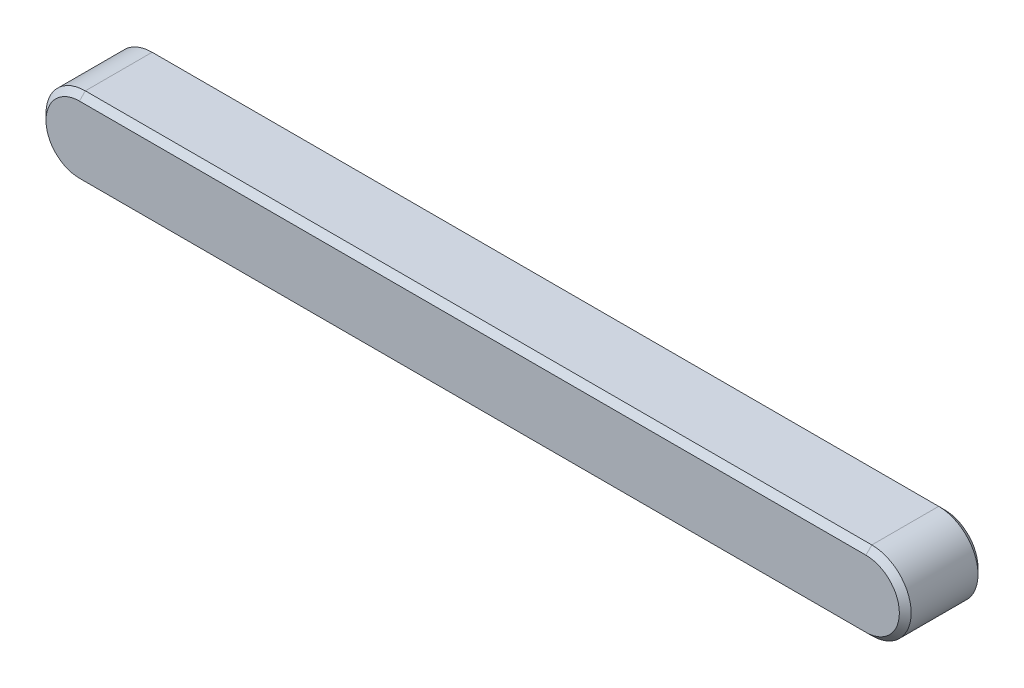
ISO-10303-21;
HEADER;
FILE_DESCRIPTION(('STEP AP214'),'2;1');
FILE_NAME('part.step','',(''),(''),'','','');
FILE_SCHEMA(('AUTOMOTIVE_DESIGN { 1 0 10303 214 1 1 1 1 }'));
ENDSEC;
DATA;
#1=APPLICATION_CONTEXT('core data for automotive mechanical design processes');
#2=APPLICATION_PROTOCOL_DEFINITION('international standard','automotive_design',2000,#1);
#3=PRODUCT_CONTEXT('',#1,'mechanical');
#4=PRODUCT('Part','Part','',(#3));
#5=PRODUCT_RELATED_PRODUCT_CATEGORY('part','',(#4));
#6=PRODUCT_DEFINITION_FORMATION('','',#4);
#7=PRODUCT_DEFINITION_CONTEXT('part definition',#1,'design');
#8=PRODUCT_DEFINITION('design','',#6,#7);
#9=PRODUCT_DEFINITION_SHAPE('','',#8);
#10=(LENGTH_UNIT() NAMED_UNIT(*) SI_UNIT(.MILLI.,.METRE.));
#11=(NAMED_UNIT(*) PLANE_ANGLE_UNIT() SI_UNIT($,.RADIAN.));
#12=(NAMED_UNIT(*) SI_UNIT($,.STERADIAN.) SOLID_ANGLE_UNIT());
#13=UNCERTAINTY_MEASURE_WITH_UNIT(LENGTH_MEASURE(1.E-05),#10,'distance_accuracy_value','');
#14=(GEOMETRIC_REPRESENTATION_CONTEXT(3) GLOBAL_UNCERTAINTY_ASSIGNED_CONTEXT((#13)) GLOBAL_UNIT_ASSIGNED_CONTEXT((#10,
#11,#12)) REPRESENTATION_CONTEXT('',''));
#15=CARTESIAN_POINT('',(0.,0.,0.));
#16=DIRECTION('',(0.,0.,1.));
#17=DIRECTION('',(1.,0.,0.));
#18=AXIS2_PLACEMENT_3D('',#15,#16,#17);
#19=CARTESIAN_POINT('',(-20.,0.,2.));
#20=DIRECTION('',(0.,0.,-1.));
#21=DIRECTION('',(-1.,0.,0.));
#22=AXIS2_PLACEMENT_3D('',#19,#20,#21);
#23=CYLINDRICAL_SURFACE('',#22,2.);
#24=DIRECTION('',(0.,0.,-1.));
#25=VECTOR('',#24,1.);
#26=CARTESIAN_POINT('',(-20.,2.,2.));
#27=LINE('',#26,#25);
#28=CARTESIAN_POINT('',(-20.,2.,1.70000000000001));
#29=VERTEX_POINT('',#28);
#30=CARTESIAN_POINT('',(-20.,2.,-1.7));
#31=VERTEX_POINT('',#30);
#32=EDGE_CURVE('E111',#29,#31,#27,.T.);
#33=ORIENTED_EDGE('',*,*,#32,.T.);
#34=CARTESIAN_POINT('',(-20.,0.,-1.7));
#35=DIRECTION('',(0.,0.,1.));
#36=DIRECTION('',(1.,0.,0.));
#37=AXIS2_PLACEMENT_3D('',#34,#35,#36);
#38=CIRCLE('',#37,2.);
#39=CARTESIAN_POINT('',(-20.,-2.,-1.7));
#40=VERTEX_POINT('',#39);
#41=EDGE_CURVE('E186',#31,#40,#38,.T.);
#42=ORIENTED_EDGE('',*,*,#41,.T.);
#43=DIRECTION('',(0.,0.,-1.));
#44=VECTOR('',#43,1.);
#45=CARTESIAN_POINT('',(-20.,-2.,2.));
#46=LINE('',#45,#44);
#47=CARTESIAN_POINT('',(-20.,-2.,1.70000000000001));
#48=VERTEX_POINT('',#47);
#49=EDGE_CURVE('E132',#48,#40,#46,.T.);
#50=ORIENTED_EDGE('',*,*,#49,.F.);
#51=CARTESIAN_POINT('',(-20.,0.,1.70000000000001));
#52=DIRECTION('',(0.,0.,1.));
#53=DIRECTION('',(1.,0.,0.));
#54=AXIS2_PLACEMENT_3D('',#51,#52,#53);
#55=CIRCLE('',#54,2.);
#56=EDGE_CURVE('E184',#48,#29,#55,.F.);
#57=ORIENTED_EDGE('',*,*,#56,.T.);
#58=EDGE_LOOP('',(#33,#42,#50,#57));
#59=FACE_BOUND('',#58,.T.);
#60=ADVANCED_FACE('F35',(#59),#23,.T.);
#61=CARTESIAN_POINT('',(-20.,-2.,2.));
#62=DIRECTION('',(0.,1.,0.));
#63=DIRECTION('',(-1.,0.,0.));
#64=AXIS2_PLACEMENT_3D('',#61,#62,#63);
#65=PLANE('',#64);
#66=ORIENTED_EDGE('',*,*,#49,.T.);
#67=DIRECTION('',(1.,0.,0.));
#68=VECTOR('',#67,1.);
#69=CARTESIAN_POINT('',(-20.,-2.,-1.7));
#70=LINE('',#69,#68);
#71=CARTESIAN_POINT('',(20.,-1.99999999999999,-1.7));
#72=VERTEX_POINT('',#71);
#73=EDGE_CURVE('E182',#40,#72,#70,.T.);
#74=ORIENTED_EDGE('',*,*,#73,.T.);
#75=DIRECTION('',(0.,0.,-1.));
#76=VECTOR('',#75,1.);
#77=CARTESIAN_POINT('',(20.,-1.99999999999999,2.));
#78=LINE('',#77,#76);
#79=CARTESIAN_POINT('',(20.,-1.99999999999999,1.70000000000001));
#80=VERTEX_POINT('',#79);
#81=EDGE_CURVE('E127',#80,#72,#78,.T.);
#82=ORIENTED_EDGE('',*,*,#81,.F.);
#83=DIRECTION('',(-1.,0.,0.));
#84=VECTOR('',#83,1.);
#85=CARTESIAN_POINT('',(-20.,-2.,1.70000000000001));
#86=LINE('',#85,#84);
#87=EDGE_CURVE('E180',#80,#48,#86,.T.);
#88=ORIENTED_EDGE('',*,*,#87,.T.);
#89=EDGE_LOOP('',(#66,#74,#82,#88));
#90=FACE_BOUND('',#89,.T.);
#91=ADVANCED_FACE('F197',(#90),#65,.F.);
#92=CARTESIAN_POINT('',(20.,0.,2.));
#93=DIRECTION('',(0.,0.,-1.));
#94=DIRECTION('',(-1.,0.,0.));
#95=AXIS2_PLACEMENT_3D('',#92,#93,#94);
#96=CYLINDRICAL_SURFACE('',#95,2.);
#97=ORIENTED_EDGE('',*,*,#81,.T.);
#98=CARTESIAN_POINT('',(20.,0.,-1.7));
#99=DIRECTION('',(0.,0.,1.));
#100=DIRECTION('',(1.,0.,0.));
#101=AXIS2_PLACEMENT_3D('',#98,#99,#100);
#102=CIRCLE('',#101,2.);
#103=CARTESIAN_POINT('',(20.,2.00000000000001,-1.7));
#104=VERTEX_POINT('',#103);
#105=EDGE_CURVE('E126',#72,#104,#102,.T.);
#106=ORIENTED_EDGE('',*,*,#105,.T.);
#107=DIRECTION('',(0.,0.,-1.));
#108=VECTOR('',#107,1.);
#109=CARTESIAN_POINT('',(20.,2.00000000000001,2.));
#110=LINE('',#109,#108);
#111=CARTESIAN_POINT('',(20.,2.00000000000001,1.70000000000001));
#112=VERTEX_POINT('',#111);
#113=EDGE_CURVE('E109',#112,#104,#110,.T.);
#114=ORIENTED_EDGE('',*,*,#113,.F.);
#115=CARTESIAN_POINT('',(20.,0.,1.70000000000001));
#116=DIRECTION('',(0.,0.,1.));
#117=DIRECTION('',(1.,0.,0.));
#118=AXIS2_PLACEMENT_3D('',#115,#116,#117);
#119=CIRCLE('',#118,2.);
#120=EDGE_CURVE('E123',#112,#80,#119,.F.);
#121=ORIENTED_EDGE('',*,*,#120,.T.);
#122=EDGE_LOOP('',(#97,#106,#114,#121));
#123=FACE_BOUND('',#122,.T.);
#124=ADVANCED_FACE('F122',(#123),#96,.T.);
#125=CARTESIAN_POINT('',(-20.,2.,2.));
#126=DIRECTION('',(0.,-1.,0.));
#127=DIRECTION('',(1.,0.,0.));
#128=AXIS2_PLACEMENT_3D('',#125,#126,#127);
#129=PLANE('',#128);
#130=ORIENTED_EDGE('',*,*,#113,.T.);
#131=DIRECTION('',(-1.,0.,0.));
#132=VECTOR('',#131,1.);
#133=CARTESIAN_POINT('',(-20.,2.,-1.7));
#134=LINE('',#133,#132);
#135=EDGE_CURVE('E115',#104,#31,#134,.T.);
#136=ORIENTED_EDGE('',*,*,#135,.T.);
#137=ORIENTED_EDGE('',*,*,#32,.F.);
#138=DIRECTION('',(1.,0.,0.));
#139=VECTOR('',#138,1.);
#140=CARTESIAN_POINT('',(20.,2.00000000000001,1.70000000000001));
#141=LINE('',#140,#139);
#142=EDGE_CURVE('E106',#29,#112,#141,.T.);
#143=ORIENTED_EDGE('',*,*,#142,.T.);
#144=EDGE_LOOP('',(#130,#136,#137,#143));
#145=FACE_BOUND('',#144,.T.);
#146=ADVANCED_FACE('F108',(#145),#129,.F.);
#147=CARTESIAN_POINT('',(-20.,0.,2.));
#148=DIRECTION('',(0.,0.,1.));
#149=DIRECTION('',(1.,0.,0.));
#150=AXIS2_PLACEMENT_3D('',#147,#148,#149);
#151=PLANE('',#150);
#152=DIRECTION('',(1.,0.,0.));
#153=VECTOR('',#152,1.);
#154=CARTESIAN_POINT('',(20.,-1.7,2.));
#155=LINE('',#154,#153);
#156=CARTESIAN_POINT('',(-20.,-1.70000000000001,2.));
#157=VERTEX_POINT('',#156);
#158=CARTESIAN_POINT('',(20.,-1.7,2.));
#159=VERTEX_POINT('',#158);
#160=EDGE_CURVE('E60',#157,#159,#155,.T.);
#161=ORIENTED_EDGE('',*,*,#160,.T.);
#162=CARTESIAN_POINT('',(20.,0.,2.));
#163=DIRECTION('',(0.,0.,1.));
#164=DIRECTION('',(1.,0.,0.));
#165=AXIS2_PLACEMENT_3D('',#162,#163,#164);
#166=CIRCLE('',#165,1.70000000000001);
#167=CARTESIAN_POINT('',(20.,1.70000000000001,2.));
#168=VERTEX_POINT('',#167);
#169=EDGE_CURVE('E11',#159,#168,#166,.T.);
#170=ORIENTED_EDGE('',*,*,#169,.T.);
#171=DIRECTION('',(-1.,0.,0.));
#172=VECTOR('',#171,1.);
#173=CARTESIAN_POINT('',(-20.,1.70000000000001,2.));
#174=LINE('',#173,#172);
#175=CARTESIAN_POINT('',(-20.,1.70000000000001,2.));
#176=VERTEX_POINT('',#175);
#177=EDGE_CURVE('E45',#168,#176,#174,.T.);
#178=ORIENTED_EDGE('',*,*,#177,.T.);
#179=CARTESIAN_POINT('',(-20.,0.,2.));
#180=DIRECTION('',(0.,0.,1.));
#181=DIRECTION('',(1.,0.,0.));
#182=AXIS2_PLACEMENT_3D('',#179,#180,#181);
#183=CIRCLE('',#182,1.70000000000001);
#184=EDGE_CURVE('E188',#176,#157,#183,.T.);
#185=ORIENTED_EDGE('',*,*,#184,.T.);
#186=EDGE_LOOP('',(#161,#170,#178,#185));
#187=FACE_BOUND('',#186,.T.);
#188=ADVANCED_FACE('F191',(#187),#151,.T.);
#189=CARTESIAN_POINT('',(-20.,0.,-2.));
#190=DIRECTION('',(0.,0.,1.));
#191=DIRECTION('',(1.,0.,0.));
#192=AXIS2_PLACEMENT_3D('',#189,#190,#191);
#193=PLANE('',#192);
#194=DIRECTION('',(1.,0.,0.));
#195=VECTOR('',#194,1.);
#196=CARTESIAN_POINT('',(-20.,1.7,-2.));
#197=LINE('',#196,#195);
#198=CARTESIAN_POINT('',(-20.,1.7,-2.));
#199=VERTEX_POINT('',#198);
#200=CARTESIAN_POINT('',(20.,1.70000000000001,-2.));
#201=VERTEX_POINT('',#200);
#202=EDGE_CURVE('E175',#199,#201,#197,.T.);
#203=ORIENTED_EDGE('',*,*,#202,.T.);
#204=CARTESIAN_POINT('',(20.,0.,-2.));
#205=DIRECTION('',(0.,0.,1.));
#206=DIRECTION('',(1.,0.,0.));
#207=AXIS2_PLACEMENT_3D('',#204,#205,#206);
#208=CIRCLE('',#207,1.7);
#209=CARTESIAN_POINT('',(20.,-1.69999999999999,-2.));
#210=VERTEX_POINT('',#209);
#211=EDGE_CURVE('E116',#201,#210,#208,.F.);
#212=ORIENTED_EDGE('',*,*,#211,.T.);
#213=DIRECTION('',(-1.,0.,0.));
#214=VECTOR('',#213,1.);
#215=CARTESIAN_POINT('',(-20.,-1.7,-2.));
#216=LINE('',#215,#214);
#217=CARTESIAN_POINT('',(-20.,-1.7,-2.));
#218=VERTEX_POINT('',#217);
#219=EDGE_CURVE('E173',#210,#218,#216,.T.);
#220=ORIENTED_EDGE('',*,*,#219,.T.);
#221=CARTESIAN_POINT('',(-20.,0.,-2.));
#222=DIRECTION('',(0.,0.,1.));
#223=DIRECTION('',(1.,0.,0.));
#224=AXIS2_PLACEMENT_3D('',#221,#222,#223);
#225=CIRCLE('',#224,1.7);
#226=EDGE_CURVE('E171',#218,#199,#225,.F.);
#227=ORIENTED_EDGE('',*,*,#226,.T.);
#228=EDGE_LOOP('',(#203,#212,#220,#227));
#229=FACE_BOUND('',#228,.T.);
#230=ADVANCED_FACE('F224',(#229),#193,.F.);
#231=CARTESIAN_POINT('',(-20.,0.,-1.7));
#232=DIRECTION('',(0.,0.,1.));
#233=DIRECTION('',(1.,0.,0.));
#234=AXIS2_PLACEMENT_3D('',#231,#232,#233);
#235=CONICAL_SURFACE('',#234,2.,0.785398163397453);
#236=DIRECTION('',(0.,0.707106781186551,0.707106781186544));
#237=VECTOR('',#236,1.);
#238=CARTESIAN_POINT('',(-20.,1.7,-2.));
#239=LINE('',#238,#237);
#240=EDGE_CURVE('E151',#199,#31,#239,.T.);
#241=ORIENTED_EDGE('',*,*,#240,.F.);
#242=ORIENTED_EDGE('',*,*,#226,.F.);
#243=DIRECTION('',(0.,0.707106781186551,-0.707106781186544));
#244=VECTOR('',#243,1.);
#245=CARTESIAN_POINT('',(-20.,-2.,-1.7));
#246=LINE('',#245,#244);
#247=EDGE_CURVE('E139',#40,#218,#246,.T.);
#248=ORIENTED_EDGE('',*,*,#247,.F.);
#249=ORIENTED_EDGE('',*,*,#41,.F.);
#250=EDGE_LOOP('',(#241,#242,#248,#249));
#251=FACE_BOUND('',#250,.T.);
#252=ADVANCED_FACE('F199',(#251),#235,.T.);
#253=CARTESIAN_POINT('',(-20.,-2.,-1.7));
#254=DIRECTION('',(0.,0.707106781186544,0.707106781186551));
#255=DIRECTION('',(1.,0.,0.));
#256=AXIS2_PLACEMENT_3D('',#253,#254,#255);
#257=PLANE('',#256);
#258=ORIENTED_EDGE('',*,*,#247,.T.);
#259=ORIENTED_EDGE('',*,*,#219,.F.);
#260=DIRECTION('',(0.,0.707106781186551,-0.707106781186544));
#261=VECTOR('',#260,1.);
#262=CARTESIAN_POINT('',(20.,-1.99999999999999,-1.7));
#263=LINE('',#262,#261);
#264=EDGE_CURVE('E145',#72,#210,#263,.T.);
#265=ORIENTED_EDGE('',*,*,#264,.F.);
#266=ORIENTED_EDGE('',*,*,#73,.F.);
#267=EDGE_LOOP('',(#258,#259,#265,#266));
#268=FACE_BOUND('',#267,.T.);
#269=ADVANCED_FACE('F202',(#268),#257,.F.);
#270=CARTESIAN_POINT('',(-20.,2.,-1.7));
#271=DIRECTION('',(0.,-0.707106781186544,0.707106781186551));
#272=DIRECTION('',(-1.,0.,0.));
#273=AXIS2_PLACEMENT_3D('',#270,#271,#272);
#274=PLANE('',#273);
#275=ORIENTED_EDGE('',*,*,#240,.T.);
#276=ORIENTED_EDGE('',*,*,#135,.F.);
#277=DIRECTION('',(0.,0.707106781186551,0.707106781186544));
#278=VECTOR('',#277,1.);
#279=CARTESIAN_POINT('',(20.,1.70000000000001,-2.));
#280=LINE('',#279,#278);
#281=EDGE_CURVE('E142',#201,#104,#280,.T.);
#282=ORIENTED_EDGE('',*,*,#281,.F.);
#283=ORIENTED_EDGE('',*,*,#202,.F.);
#284=EDGE_LOOP('',(#275,#276,#282,#283));
#285=FACE_BOUND('',#284,.T.);
#286=ADVANCED_FACE('F205',(#285),#274,.F.);
#287=CARTESIAN_POINT('',(20.,0.,-1.7));
#288=DIRECTION('',(0.,0.,1.));
#289=DIRECTION('',(1.,0.,0.));
#290=AXIS2_PLACEMENT_3D('',#287,#288,#289);
#291=CONICAL_SURFACE('',#290,2.,0.785398163397453);
#292=ORIENTED_EDGE('',*,*,#264,.T.);
#293=ORIENTED_EDGE('',*,*,#211,.F.);
#294=ORIENTED_EDGE('',*,*,#281,.T.);
#295=ORIENTED_EDGE('',*,*,#105,.F.);
#296=EDGE_LOOP('',(#292,#293,#294,#295));
#297=FACE_BOUND('',#296,.T.);
#298=ADVANCED_FACE('F203',(#297),#291,.T.);
#299=CARTESIAN_POINT('',(-20.,0.,2.));
#300=DIRECTION('',(0.,0.,-1.));
#301=DIRECTION('',(-1.,0.,0.));
#302=AXIS2_PLACEMENT_3D('',#299,#300,#301);
#303=CONICAL_SURFACE('',#302,1.70000000000001,0.785398163397451);
#304=DIRECTION('',(0.,-0.70710678118655,0.707106781186545));
#305=VECTOR('',#304,1.);
#306=CARTESIAN_POINT('',(-20.,2.,1.70000000000001));
#307=LINE('',#306,#305);
#308=EDGE_CURVE('E136',#29,#176,#307,.T.);
#309=ORIENTED_EDGE('',*,*,#308,.F.);
#310=ORIENTED_EDGE('',*,*,#56,.F.);
#311=DIRECTION('',(0.,-0.70710678118655,-0.707106781186545));
#312=VECTOR('',#311,1.);
#313=CARTESIAN_POINT('',(-20.,-1.70000000000001,2.));
#314=LINE('',#313,#312);
#315=EDGE_CURVE('E40',#157,#48,#314,.T.);
#316=ORIENTED_EDGE('',*,*,#315,.F.);
#317=ORIENTED_EDGE('',*,*,#184,.F.);
#318=EDGE_LOOP('',(#309,#310,#316,#317));
#319=FACE_BOUND('',#318,.T.);
#320=ADVANCED_FACE('F38',(#319),#303,.T.);
#321=CARTESIAN_POINT('',(-20.,-1.70000000000001,2.));
#322=DIRECTION('',(0.,-0.707106781186545,0.70710678118655));
#323=DIRECTION('',(-1.,0.,0.));
#324=AXIS2_PLACEMENT_3D('',#321,#322,#323);
#325=PLANE('',#324);
#326=ORIENTED_EDGE('',*,*,#315,.T.);
#327=ORIENTED_EDGE('',*,*,#87,.F.);
#328=DIRECTION('',(0.,-0.70710678118655,-0.707106781186545));
#329=VECTOR('',#328,1.);
#330=CARTESIAN_POINT('',(20.,-1.7,2.));
#331=LINE('',#330,#329);
#332=EDGE_CURVE('E130',#159,#80,#331,.T.);
#333=ORIENTED_EDGE('',*,*,#332,.F.);
#334=ORIENTED_EDGE('',*,*,#160,.F.);
#335=EDGE_LOOP('',(#326,#327,#333,#334));
#336=FACE_BOUND('',#335,.T.);
#337=ADVANCED_FACE('F194',(#336),#325,.T.);
#338=CARTESIAN_POINT('',(-20.,1.70000000000001,2.));
#339=DIRECTION('',(0.,0.707106781186545,0.70710678118655));
#340=DIRECTION('',(1.,0.,0.));
#341=AXIS2_PLACEMENT_3D('',#338,#339,#340);
#342=PLANE('',#341);
#343=ORIENTED_EDGE('',*,*,#308,.T.);
#344=ORIENTED_EDGE('',*,*,#177,.F.);
#345=DIRECTION('',(0.,-0.70710678118655,0.707106781186545));
#346=VECTOR('',#345,1.);
#347=CARTESIAN_POINT('',(20.,2.00000000000001,1.70000000000001));
#348=LINE('',#347,#346);
#349=EDGE_CURVE('E53',#112,#168,#348,.T.);
#350=ORIENTED_EDGE('',*,*,#349,.F.);
#351=ORIENTED_EDGE('',*,*,#142,.F.);
#352=EDGE_LOOP('',(#343,#344,#350,#351));
#353=FACE_BOUND('',#352,.T.);
#354=ADVANCED_FACE('F134',(#353),#342,.T.);
#355=CARTESIAN_POINT('',(20.,0.,2.));
#356=DIRECTION('',(0.,0.,-1.));
#357=DIRECTION('',(-1.,0.,0.));
#358=AXIS2_PLACEMENT_3D('',#355,#356,#357);
#359=CONICAL_SURFACE('',#358,1.70000000000001,0.785398163397451);
#360=ORIENTED_EDGE('',*,*,#332,.T.);
#361=ORIENTED_EDGE('',*,*,#120,.F.);
#362=ORIENTED_EDGE('',*,*,#349,.T.);
#363=ORIENTED_EDGE('',*,*,#169,.F.);
#364=EDGE_LOOP('',(#360,#361,#362,#363));
#365=FACE_BOUND('',#364,.T.);
#366=ADVANCED_FACE('F129',(#365),#359,.T.);
#367=CLOSED_SHELL('',(#60,#91,#124,#146,#188,#230,#252,#269,#286,#298,#320,#337,#354,#366));
#368=MANIFOLD_SOLID_BREP('B2',#367);
#369=ADVANCED_BREP_SHAPE_REPRESENTATION('',(#18,#368),#14);
#370=SHAPE_DEFINITION_REPRESENTATION(#9,#369);
ENDSEC;
END-ISO-10303-21;
